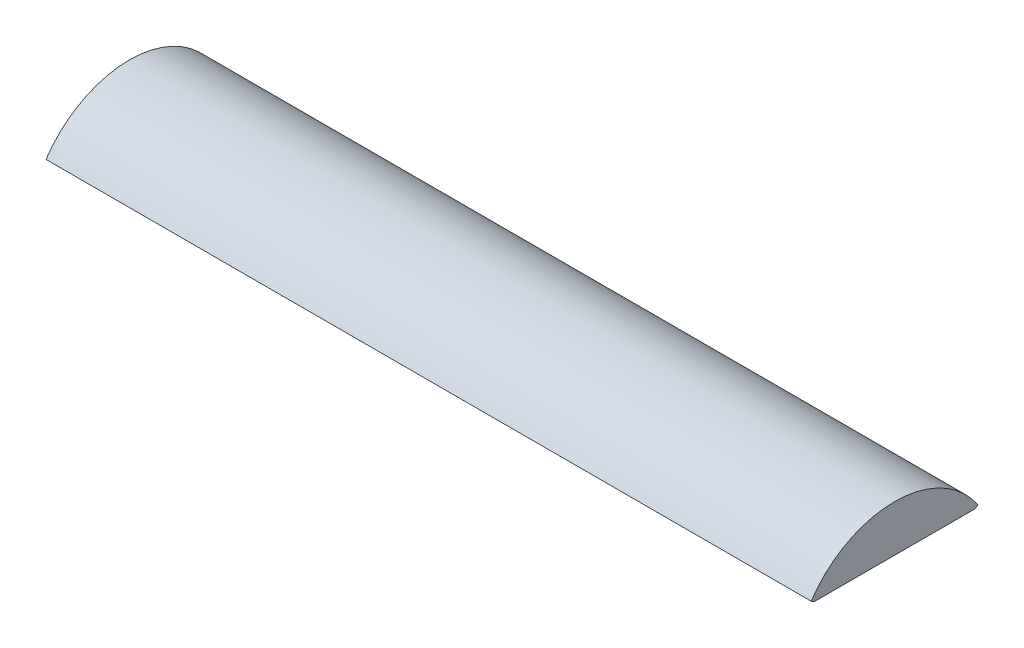
ISO-10303-21;
HEADER;
FILE_DESCRIPTION(('STEP AP214'),'2;1');
FILE_NAME('part.step','',(''),(''),'','','');
FILE_SCHEMA(('AUTOMOTIVE_DESIGN { 1 0 10303 214 1 1 1 1 }'));
ENDSEC;
DATA;
#1=APPLICATION_CONTEXT('core data for automotive mechanical design processes');
#2=APPLICATION_PROTOCOL_DEFINITION('international standard','automotive_design',2000,#1);
#3=PRODUCT_CONTEXT('',#1,'mechanical');
#4=PRODUCT('Part','Part','',(#3));
#5=PRODUCT_RELATED_PRODUCT_CATEGORY('part','',(#4));
#6=PRODUCT_DEFINITION_FORMATION('','',#4);
#7=PRODUCT_DEFINITION_CONTEXT('part definition',#1,'design');
#8=PRODUCT_DEFINITION('design','',#6,#7);
#9=PRODUCT_DEFINITION_SHAPE('','',#8);
#10=(LENGTH_UNIT() NAMED_UNIT(*) SI_UNIT(.MILLI.,.METRE.));
#11=(NAMED_UNIT(*) PLANE_ANGLE_UNIT() SI_UNIT($,.RADIAN.));
#12=(NAMED_UNIT(*) SI_UNIT($,.STERADIAN.) SOLID_ANGLE_UNIT());
#13=UNCERTAINTY_MEASURE_WITH_UNIT(LENGTH_MEASURE(1.E-05),#10,'distance_accuracy_value','');
#14=(GEOMETRIC_REPRESENTATION_CONTEXT(3) GLOBAL_UNCERTAINTY_ASSIGNED_CONTEXT((#13)) GLOBAL_UNIT_ASSIGNED_CONTEXT((#10,
#11,#12)) REPRESENTATION_CONTEXT('',''));
#15=CARTESIAN_POINT('',(0.,0.,0.));
#16=DIRECTION('',(0.,0.,1.));
#17=DIRECTION('',(1.,0.,0.));
#18=AXIS2_PLACEMENT_3D('',#15,#16,#17);
#19=CARTESIAN_POINT('',(332.5,-24.2929002979518,27.928417970611));
#20=DIRECTION('',(-1.,0.,0.));
#21=DIRECTION('',(0.,0.,1.));
#22=AXIS2_PLACEMENT_3D('',#19,#20,#21);
#23=CYLINDRICAL_SURFACE('',#22,42.1372261364792);
#24=DIRECTION('',(-1.,0.,0.));
#25=VECTOR('',#24,1.);
#26=CARTESIAN_POINT('',(332.5,-0.835051942416339,-7.07551290872727));
#27=LINE('',#26,#25);
#28=CARTESIAN_POINT('',(332.,-0.835051942416339,-7.07551290872727));
#29=VERTEX_POINT('',#28);
#30=CARTESIAN_POINT('',(0.5,-0.835051942416339,-7.07551290872727));
#31=VERTEX_POINT('',#30);
#32=EDGE_CURVE('E54',#29,#31,#27,.T.);
#33=ORIENTED_EDGE('',*,*,#32,.F.);
#34=CARTESIAN_POINT('',(332.,-24.2929002979518,27.928417970611));
#35=DIRECTION('',(1.,0.,0.));
#36=DIRECTION('',(0.,0.,1.));
#37=AXIS2_PLACEMENT_3D('',#34,#35,#36);
#38=CIRCLE('',#37,42.1372261364792);
#39=CARTESIAN_POINT('',(332.,-0.835051942416325,62.9323488499492));
#40=VERTEX_POINT('',#39);
#41=EDGE_CURVE('E114',#29,#40,#38,.T.);
#42=ORIENTED_EDGE('',*,*,#41,.T.);
#43=DIRECTION('',(-1.,0.,0.));
#44=VECTOR('',#43,1.);
#45=CARTESIAN_POINT('',(332.5,-0.835051942416325,62.9323488499492));
#46=LINE('',#45,#44);
#47=CARTESIAN_POINT('',(0.5,-0.835051942416325,62.9323488499492));
#48=VERTEX_POINT('',#47);
#49=EDGE_CURVE('E66',#40,#48,#46,.T.);
#50=ORIENTED_EDGE('',*,*,#49,.T.);
#51=CARTESIAN_POINT('',(0.5,-24.2929002979518,27.928417970611));
#52=DIRECTION('',(-1.,0.,0.));
#53=DIRECTION('',(0.,0.,-1.));
#54=AXIS2_PLACEMENT_3D('',#51,#52,#53);
#55=CIRCLE('',#54,42.1372261364792);
#56=EDGE_CURVE('E193',#48,#31,#55,.T.);
#57=ORIENTED_EDGE('',*,*,#56,.T.);
#58=EDGE_LOOP('',(#33,#42,#50,#57));
#59=FACE_BOUND('',#58,.T.);
#60=ADVANCED_FACE('F46',(#59),#23,.F.);
#61=CARTESIAN_POINT('',(332.5,0.,-8.32158202938901));
#62=DIRECTION('',(0.,-0.830712747107825,-0.55670129494422));
#63=DIRECTION('',(0.,0.55670129494422,-0.830712747107825));
#64=AXIS2_PLACEMENT_3D('',#61,#62,#63);
#65=PLANE('',#64);
#66=DIRECTION('',(0.,-0.55670129494422,0.830712747107825));
#67=VECTOR('',#66,1.);
#68=CARTESIAN_POINT('',(0.,0.,-8.32158202938901));
#69=LINE('',#68,#67);
#70=CARTESIAN_POINT('',(0.,0.,-8.32158202938901));
#71=VERTEX_POINT('',#70);
#72=CARTESIAN_POINT('',(0.,-0.835051942416339,-7.07551290872727));
#73=VERTEX_POINT('',#72);
#74=EDGE_CURVE('E174',#71,#73,#69,.T.);
#75=ORIENTED_EDGE('',*,*,#74,.F.);
#76=DIRECTION('',(-1.,0.,0.));
#77=VECTOR('',#76,1.);
#78=CARTESIAN_POINT('',(332.5,0.,-8.32158202938901));
#79=LINE('',#78,#77);
#80=CARTESIAN_POINT('',(332.5,0.,-8.32158202938901));
#81=VERTEX_POINT('',#80);
#82=EDGE_CURVE('E136',#81,#71,#79,.T.);
#83=ORIENTED_EDGE('',*,*,#82,.F.);
#84=DIRECTION('',(0.,-0.55670129494422,0.830712747107825));
#85=VECTOR('',#84,1.);
#86=CARTESIAN_POINT('',(332.5,0.,-8.32158202938901));
#87=LINE('',#86,#85);
#88=CARTESIAN_POINT('',(332.5,-0.835051942416339,-7.07551290872727));
#89=VERTEX_POINT('',#88);
#90=EDGE_CURVE('E158',#81,#89,#87,.T.);
#91=ORIENTED_EDGE('',*,*,#90,.T.);
#92=EDGE_CURVE('E11',#89,#29,#27,.T.);
#93=ORIENTED_EDGE('',*,*,#92,.T.);
#94=ORIENTED_EDGE('',*,*,#32,.T.);
#95=DIRECTION('',(-1.,0.,0.));
#96=VECTOR('',#95,1.);
#97=CARTESIAN_POINT('',(0.5,-0.835051942416339,-7.07551290872727));
#98=LINE('',#97,#96);
#99=EDGE_CURVE('E182',#31,#73,#98,.T.);
#100=ORIENTED_EDGE('',*,*,#99,.T.);
#101=EDGE_LOOP('',(#75,#83,#91,#93,#94,#100));
#102=FACE_BOUND('',#101,.T.);
#103=ADVANCED_FACE('F216',(#102),#65,.T.);
#104=CARTESIAN_POINT('',(332.5,-24.2929002979518,27.928417970611));
#105=DIRECTION('',(-1.,0.,0.));
#106=DIRECTION('',(0.,0.,1.));
#107=AXIS2_PLACEMENT_3D('',#104,#105,#106);
#108=CYLINDRICAL_SURFACE('',#107,43.6372261364792);
#109=CARTESIAN_POINT('',(0.,-24.2929002979518,27.928417970611));
#110=DIRECTION('',(-1.,0.,0.));
#111=DIRECTION('',(0.,0.,1.));
#112=AXIS2_PLACEMENT_3D('',#109,#110,#111);
#113=CIRCLE('',#112,43.6372261364792);
#114=CARTESIAN_POINT('',(0.,0.,64.178417970611));
#115=VERTEX_POINT('',#114);
#116=EDGE_CURVE('E169',#115,#71,#113,.T.);
#117=ORIENTED_EDGE('',*,*,#116,.F.);
#118=DIRECTION('',(-1.,0.,0.));
#119=VECTOR('',#118,1.);
#120=CARTESIAN_POINT('',(332.5,0.,64.178417970611));
#121=LINE('',#120,#119);
#122=CARTESIAN_POINT('',(332.5,0.,64.178417970611));
#123=VERTEX_POINT('',#122);
#124=EDGE_CURVE('E110',#123,#115,#121,.T.);
#125=ORIENTED_EDGE('',*,*,#124,.F.);
#126=CARTESIAN_POINT('',(332.5,-24.2929002979518,27.928417970611));
#127=DIRECTION('',(-1.,0.,0.));
#128=DIRECTION('',(0.,0.,1.));
#129=AXIS2_PLACEMENT_3D('',#126,#127,#128);
#130=CIRCLE('',#129,43.6372261364792);
#131=EDGE_CURVE('E129',#123,#81,#130,.T.);
#132=ORIENTED_EDGE('',*,*,#131,.T.);
#133=ORIENTED_EDGE('',*,*,#82,.T.);
#134=EDGE_LOOP('',(#117,#125,#132,#133));
#135=FACE_BOUND('',#134,.T.);
#136=ADVANCED_FACE('F221',(#135),#108,.T.);
#137=CARTESIAN_POINT('',(332.5,-0.835051942416325,62.9323488499492));
#138=DIRECTION('',(0.,-0.830712747107827,0.556701294944216));
#139=DIRECTION('',(0.,-0.556701294944216,-0.830712747107827));
#140=AXIS2_PLACEMENT_3D('',#137,#138,#139);
#141=PLANE('',#140);
#142=DIRECTION('',(0.,0.556701294944216,0.830712747107827));
#143=VECTOR('',#142,1.);
#144=CARTESIAN_POINT('',(0.,-0.835051942416325,62.9323488499492));
#145=LINE('',#144,#143);
#146=CARTESIAN_POINT('',(0.,-0.835051942416325,62.9323488499492));
#147=VERTEX_POINT('',#146);
#148=EDGE_CURVE('E133',#147,#115,#145,.T.);
#149=ORIENTED_EDGE('',*,*,#148,.F.);
#150=DIRECTION('',(-1.,0.,0.));
#151=VECTOR('',#150,1.);
#152=CARTESIAN_POINT('',(0.5,-0.835051942416325,62.9323488499492));
#153=LINE('',#152,#151);
#154=EDGE_CURVE('E122',#48,#147,#153,.T.);
#155=ORIENTED_EDGE('',*,*,#154,.F.);
#156=ORIENTED_EDGE('',*,*,#49,.F.);
#157=CARTESIAN_POINT('',(332.5,-0.835051942416325,62.9323488499492));
#158=VERTEX_POINT('',#157);
#159=EDGE_CURVE('E100',#158,#40,#46,.T.);
#160=ORIENTED_EDGE('',*,*,#159,.F.);
#161=DIRECTION('',(0.,0.556701294944216,0.830712747107827));
#162=VECTOR('',#161,1.);
#163=CARTESIAN_POINT('',(332.5,-0.835051942416325,62.9323488499492));
#164=LINE('',#163,#162);
#165=EDGE_CURVE('E125',#158,#123,#164,.T.);
#166=ORIENTED_EDGE('',*,*,#165,.T.);
#167=ORIENTED_EDGE('',*,*,#124,.T.);
#168=EDGE_LOOP('',(#149,#155,#156,#160,#166,#167));
#169=FACE_BOUND('',#168,.T.);
#170=ADVANCED_FACE('F120',(#169),#141,.T.);
#171=CARTESIAN_POINT('',(332.5,-24.2929002979518,27.928417970611));
#172=DIRECTION('',(1.,0.,0.));
#173=DIRECTION('',(0.,0.,-1.));
#174=AXIS2_PLACEMENT_3D('',#171,#172,#173);
#175=PLANE('',#174);
#176=ORIENTED_EDGE('',*,*,#165,.F.);
#177=DIRECTION('',(0.,0.,-1.));
#178=VECTOR('',#177,1.);
#179=CARTESIAN_POINT('',(332.5,-0.835051942416325,62.9323488499492));
#180=LINE('',#179,#178);
#181=EDGE_CURVE('E105',#158,#89,#180,.T.);
#182=ORIENTED_EDGE('',*,*,#181,.T.);
#183=ORIENTED_EDGE('',*,*,#90,.F.);
#184=ORIENTED_EDGE('',*,*,#131,.F.);
#185=EDGE_LOOP('',(#176,#182,#183,#184));
#186=FACE_BOUND('',#185,.T.);
#187=ADVANCED_FACE('F214',(#186),#175,.T.);
#188=CARTESIAN_POINT('',(0.,-24.2929002979518,27.928417970611));
#189=DIRECTION('',(1.,0.,0.));
#190=DIRECTION('',(0.,0.,-1.));
#191=AXIS2_PLACEMENT_3D('',#188,#189,#190);
#192=PLANE('',#191);
#193=ORIENTED_EDGE('',*,*,#74,.T.);
#194=DIRECTION('',(0.,0.,1.));
#195=VECTOR('',#194,1.);
#196=CARTESIAN_POINT('',(0.,-0.835051942416339,-7.07551290872727));
#197=LINE('',#196,#195);
#198=EDGE_CURVE('E116',#73,#147,#197,.T.);
#199=ORIENTED_EDGE('',*,*,#198,.T.);
#200=ORIENTED_EDGE('',*,*,#148,.T.);
#201=ORIENTED_EDGE('',*,*,#116,.T.);
#202=EDGE_LOOP('',(#193,#199,#200,#201));
#203=FACE_BOUND('',#202,.T.);
#204=ADVANCED_FACE('F220',(#203),#192,.F.);
#205=CARTESIAN_POINT('',(0.5,-0.835051942416339,-7.07551290872727));
#206=DIRECTION('',(0.,-1.,0.));
#207=DIRECTION('',(0.,0.,-1.));
#208=AXIS2_PLACEMENT_3D('',#205,#206,#207);
#209=PLANE('',#208);
#210=ORIENTED_EDGE('',*,*,#198,.F.);
#211=ORIENTED_EDGE('',*,*,#99,.F.);
#212=DIRECTION('',(0.,0.,1.));
#213=VECTOR('',#212,1.);
#214=CARTESIAN_POINT('',(0.5,-0.835051942416339,-7.07551290872727));
#215=LINE('',#214,#213);
#216=EDGE_CURVE('E187',#31,#48,#215,.T.);
#217=ORIENTED_EDGE('',*,*,#216,.T.);
#218=ORIENTED_EDGE('',*,*,#154,.T.);
#219=EDGE_LOOP('',(#210,#211,#217,#218));
#220=FACE_BOUND('',#219,.T.);
#221=ADVANCED_FACE('F223',(#220),#209,.T.);
#222=CARTESIAN_POINT('',(0.5,-24.2929002979518,27.928417970611));
#223=DIRECTION('',(1.,0.,0.));
#224=DIRECTION('',(0.,0.,-1.));
#225=AXIS2_PLACEMENT_3D('',#222,#223,#224);
#226=PLANE('',#225);
#227=ORIENTED_EDGE('',*,*,#56,.F.);
#228=ORIENTED_EDGE('',*,*,#216,.F.);
#229=EDGE_LOOP('',(#227,#228));
#230=FACE_BOUND('',#229,.T.);
#231=ADVANCED_FACE('F226',(#230),#226,.T.);
#232=CARTESIAN_POINT('',(332.,-0.835051942416325,62.9323488499492));
#233=DIRECTION('',(0.,-1.,0.));
#234=DIRECTION('',(0.,0.,-1.));
#235=AXIS2_PLACEMENT_3D('',#232,#233,#234);
#236=PLANE('',#235);
#237=ORIENTED_EDGE('',*,*,#181,.F.);
#238=ORIENTED_EDGE('',*,*,#159,.T.);
#239=DIRECTION('',(0.,0.,-1.));
#240=VECTOR('',#239,1.);
#241=CARTESIAN_POINT('',(332.,-0.835051942416325,62.9323488499492));
#242=LINE('',#241,#240);
#243=EDGE_CURVE('E104',#40,#29,#242,.T.);
#244=ORIENTED_EDGE('',*,*,#243,.T.);
#245=ORIENTED_EDGE('',*,*,#92,.F.);
#246=EDGE_LOOP('',(#237,#238,#244,#245));
#247=FACE_BOUND('',#246,.T.);
#248=ADVANCED_FACE('F102',(#247),#236,.T.);
#249=CARTESIAN_POINT('',(332.,-24.2929002979518,27.928417970611));
#250=DIRECTION('',(-1.,0.,0.));
#251=DIRECTION('',(0.,0.,1.));
#252=AXIS2_PLACEMENT_3D('',#249,#250,#251);
#253=PLANE('',#252);
#254=ORIENTED_EDGE('',*,*,#41,.F.);
#255=ORIENTED_EDGE('',*,*,#243,.F.);
#256=EDGE_LOOP('',(#254,#255));
#257=FACE_BOUND('',#256,.T.);
#258=ADVANCED_FACE('F113',(#257),#253,.T.);
#259=CLOSED_SHELL('',(#60,#103,#136,#170,#187,#204,#221,#231,#248,#258));
#260=MANIFOLD_SOLID_BREP('B2',#259);
#261=ADVANCED_BREP_SHAPE_REPRESENTATION('',(#18,#260),#14);
#262=SHAPE_DEFINITION_REPRESENTATION(#9,#261);
ENDSEC;
END-ISO-10303-21;
